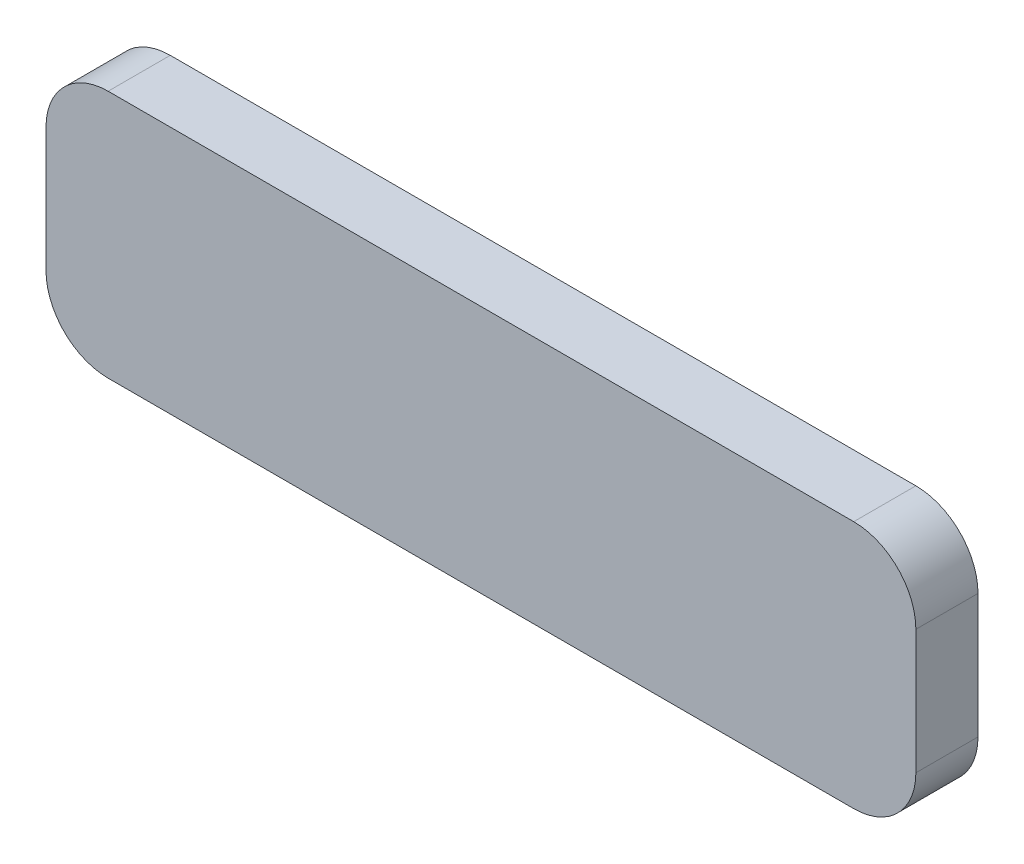
ISO-10303-21;
HEADER;
FILE_DESCRIPTION(('STEP AP214'),'2;1');
FILE_NAME('part.step','',(''),(''),'','','');
FILE_SCHEMA(('AUTOMOTIVE_DESIGN { 1 0 10303 214 1 1 1 1 }'));
ENDSEC;
DATA;
#1=APPLICATION_CONTEXT('core data for automotive mechanical design processes');
#2=APPLICATION_PROTOCOL_DEFINITION('international standard','automotive_design',2000,#1);
#3=PRODUCT_CONTEXT('',#1,'mechanical');
#4=PRODUCT('Part','Part','',(#3));
#5=PRODUCT_RELATED_PRODUCT_CATEGORY('part','',(#4));
#6=PRODUCT_DEFINITION_FORMATION('','',#4);
#7=PRODUCT_DEFINITION_CONTEXT('part definition',#1,'design');
#8=PRODUCT_DEFINITION('design','',#6,#7);
#9=PRODUCT_DEFINITION_SHAPE('','',#8);
#10=(LENGTH_UNIT() NAMED_UNIT(*) SI_UNIT(.MILLI.,.METRE.));
#11=(NAMED_UNIT(*) PLANE_ANGLE_UNIT() SI_UNIT($,.RADIAN.));
#12=(NAMED_UNIT(*) SI_UNIT($,.STERADIAN.) SOLID_ANGLE_UNIT());
#13=UNCERTAINTY_MEASURE_WITH_UNIT(LENGTH_MEASURE(1.E-05),#10,'distance_accuracy_value','');
#14=(GEOMETRIC_REPRESENTATION_CONTEXT(3) GLOBAL_UNCERTAINTY_ASSIGNED_CONTEXT((#13)) GLOBAL_UNIT_ASSIGNED_CONTEXT((#10,
#11,#12)) REPRESENTATION_CONTEXT('',''));
#15=CARTESIAN_POINT('',(0.,0.,0.));
#16=DIRECTION('',(0.,0.,1.));
#17=DIRECTION('',(1.,0.,0.));
#18=AXIS2_PLACEMENT_3D('',#15,#16,#17);
#19=CARTESIAN_POINT('',(1.,1.,1.));
#20=DIRECTION('',(0.,0.,-1.));
#21=DIRECTION('',(-1.,0.,0.));
#22=AXIS2_PLACEMENT_3D('',#19,#20,#21);
#23=CYLINDRICAL_SURFACE('',#22,1.);
#24=CARTESIAN_POINT('',(1.,1.,0.));
#25=DIRECTION('',(0.,0.,1.));
#26=DIRECTION('',(-1.,0.,0.));
#27=AXIS2_PLACEMENT_3D('',#24,#25,#26);
#28=CIRCLE('',#27,1.);
#29=CARTESIAN_POINT('',(0.,1.,0.));
#30=VERTEX_POINT('',#29);
#31=CARTESIAN_POINT('',(1.,0.,0.));
#32=VERTEX_POINT('',#31);
#33=EDGE_CURVE('E133',#30,#32,#28,.T.);
#34=ORIENTED_EDGE('',*,*,#33,.T.);
#35=DIRECTION('',(0.,0.,-1.));
#36=VECTOR('',#35,1.);
#37=CARTESIAN_POINT('',(1.,0.,1.));
#38=LINE('',#37,#36);
#39=CARTESIAN_POINT('',(1.,0.,1.));
#40=VERTEX_POINT('',#39);
#41=EDGE_CURVE('E11',#40,#32,#38,.T.);
#42=ORIENTED_EDGE('',*,*,#41,.F.);
#43=CARTESIAN_POINT('',(1.,1.,1.));
#44=DIRECTION('',(0.,0.,1.));
#45=DIRECTION('',(-1.,0.,0.));
#46=AXIS2_PLACEMENT_3D('',#43,#44,#45);
#47=CIRCLE('',#46,1.);
#48=CARTESIAN_POINT('',(0.,1.,1.));
#49=VERTEX_POINT('',#48);
#50=EDGE_CURVE('E147',#49,#40,#47,.T.);
#51=ORIENTED_EDGE('',*,*,#50,.F.);
#52=DIRECTION('',(0.,0.,-1.));
#53=VECTOR('',#52,1.);
#54=CARTESIAN_POINT('',(0.,1.,1.));
#55=LINE('',#54,#53);
#56=EDGE_CURVE('E129',#49,#30,#55,.T.);
#57=ORIENTED_EDGE('',*,*,#56,.T.);
#58=EDGE_LOOP('',(#34,#42,#51,#57));
#59=FACE_BOUND('',#58,.T.);
#60=ADVANCED_FACE('F37',(#59),#23,.T.);
#61=CARTESIAN_POINT('',(1.,0.,1.));
#62=DIRECTION('',(0.,1.,0.));
#63=DIRECTION('',(0.,0.,1.));
#64=AXIS2_PLACEMENT_3D('',#61,#62,#63);
#65=PLANE('',#64);
#66=DIRECTION('',(1.,0.,0.));
#67=VECTOR('',#66,1.);
#68=CARTESIAN_POINT('',(1.,0.,0.));
#69=LINE('',#68,#67);
#70=CARTESIAN_POINT('',(13.,0.,0.));
#71=VERTEX_POINT('',#70);
#72=EDGE_CURVE('E136',#32,#71,#69,.T.);
#73=ORIENTED_EDGE('',*,*,#72,.T.);
#74=DIRECTION('',(0.,0.,-1.));
#75=VECTOR('',#74,1.);
#76=CARTESIAN_POINT('',(13.,0.,1.));
#77=LINE('',#76,#75);
#78=CARTESIAN_POINT('',(13.,0.,1.));
#79=VERTEX_POINT('',#78);
#80=EDGE_CURVE('E45',#79,#71,#77,.T.);
#81=ORIENTED_EDGE('',*,*,#80,.F.);
#82=DIRECTION('',(1.,0.,0.));
#83=VECTOR('',#82,1.);
#84=CARTESIAN_POINT('',(1.,0.,1.));
#85=LINE('',#84,#83);
#86=EDGE_CURVE('E96',#40,#79,#85,.T.);
#87=ORIENTED_EDGE('',*,*,#86,.F.);
#88=ORIENTED_EDGE('',*,*,#41,.T.);
#89=EDGE_LOOP('',(#73,#81,#87,#88));
#90=FACE_BOUND('',#89,.T.);
#91=ADVANCED_FACE('F182',(#90),#65,.F.);
#92=CARTESIAN_POINT('',(13.,1.,1.));
#93=DIRECTION('',(0.,0.,-1.));
#94=DIRECTION('',(-1.,0.,0.));
#95=AXIS2_PLACEMENT_3D('',#92,#93,#94);
#96=CYLINDRICAL_SURFACE('',#95,1.);
#97=CARTESIAN_POINT('',(13.,1.,0.));
#98=DIRECTION('',(0.,0.,1.));
#99=DIRECTION('',(-1.,0.,0.));
#100=AXIS2_PLACEMENT_3D('',#97,#98,#99);
#101=CIRCLE('',#100,1.);
#102=CARTESIAN_POINT('',(14.,1.,0.));
#103=VERTEX_POINT('',#102);
#104=EDGE_CURVE('E138',#71,#103,#101,.T.);
#105=ORIENTED_EDGE('',*,*,#104,.T.);
#106=DIRECTION('',(0.,0.,-1.));
#107=VECTOR('',#106,1.);
#108=CARTESIAN_POINT('',(14.,1.,1.));
#109=LINE('',#108,#107);
#110=CARTESIAN_POINT('',(14.,1.,1.));
#111=VERTEX_POINT('',#110);
#112=EDGE_CURVE('E154',#111,#103,#109,.T.);
#113=ORIENTED_EDGE('',*,*,#112,.F.);
#114=CARTESIAN_POINT('',(13.,1.,1.));
#115=DIRECTION('',(0.,0.,1.));
#116=DIRECTION('',(-1.,0.,0.));
#117=AXIS2_PLACEMENT_3D('',#114,#115,#116);
#118=CIRCLE('',#117,1.);
#119=EDGE_CURVE('E162',#79,#111,#118,.T.);
#120=ORIENTED_EDGE('',*,*,#119,.F.);
#121=ORIENTED_EDGE('',*,*,#80,.T.);
#122=EDGE_LOOP('',(#105,#113,#120,#121));
#123=FACE_BOUND('',#122,.T.);
#124=ADVANCED_FACE('F160',(#123),#96,.T.);
#125=CARTESIAN_POINT('',(14.,1.,1.));
#126=DIRECTION('',(-1.,0.,0.));
#127=DIRECTION('',(0.,0.,1.));
#128=AXIS2_PLACEMENT_3D('',#125,#126,#127);
#129=PLANE('',#128);
#130=DIRECTION('',(0.,1.,0.));
#131=VECTOR('',#130,1.);
#132=CARTESIAN_POINT('',(14.,1.,0.));
#133=LINE('',#132,#131);
#134=CARTESIAN_POINT('',(14.,3.,0.));
#135=VERTEX_POINT('',#134);
#136=EDGE_CURVE('E140',#103,#135,#133,.T.);
#137=ORIENTED_EDGE('',*,*,#136,.T.);
#138=DIRECTION('',(0.,0.,-1.));
#139=VECTOR('',#138,1.);
#140=CARTESIAN_POINT('',(14.,3.,1.));
#141=LINE('',#140,#139);
#142=CARTESIAN_POINT('',(14.,3.,1.));
#143=VERTEX_POINT('',#142);
#144=EDGE_CURVE('E151',#143,#135,#141,.T.);
#145=ORIENTED_EDGE('',*,*,#144,.F.);
#146=DIRECTION('',(0.,1.,0.));
#147=VECTOR('',#146,1.);
#148=CARTESIAN_POINT('',(14.,1.,1.));
#149=LINE('',#148,#147);
#150=EDGE_CURVE('E174',#111,#143,#149,.T.);
#151=ORIENTED_EDGE('',*,*,#150,.F.);
#152=ORIENTED_EDGE('',*,*,#112,.T.);
#153=EDGE_LOOP('',(#137,#145,#151,#152));
#154=FACE_BOUND('',#153,.T.);
#155=ADVANCED_FACE('F170',(#154),#129,.F.);
#156=CARTESIAN_POINT('',(13.,3.,1.));
#157=DIRECTION('',(0.,0.,-1.));
#158=DIRECTION('',(-1.,0.,0.));
#159=AXIS2_PLACEMENT_3D('',#156,#157,#158);
#160=CYLINDRICAL_SURFACE('',#159,1.);
#161=CARTESIAN_POINT('',(13.,3.,0.));
#162=DIRECTION('',(0.,0.,1.));
#163=DIRECTION('',(-1.,0.,0.));
#164=AXIS2_PLACEMENT_3D('',#161,#162,#163);
#165=CIRCLE('',#164,1.);
#166=CARTESIAN_POINT('',(13.,4.,0.));
#167=VERTEX_POINT('',#166);
#168=EDGE_CURVE('E142',#135,#167,#165,.T.);
#169=ORIENTED_EDGE('',*,*,#168,.T.);
#170=DIRECTION('',(0.,0.,-1.));
#171=VECTOR('',#170,1.);
#172=CARTESIAN_POINT('',(13.,4.,1.));
#173=LINE('',#172,#171);
#174=CARTESIAN_POINT('',(13.,4.,1.));
#175=VERTEX_POINT('',#174);
#176=EDGE_CURVE('E124',#175,#167,#173,.T.);
#177=ORIENTED_EDGE('',*,*,#176,.F.);
#178=CARTESIAN_POINT('',(13.,3.,1.));
#179=DIRECTION('',(0.,0.,1.));
#180=DIRECTION('',(-1.,0.,0.));
#181=AXIS2_PLACEMENT_3D('',#178,#179,#180);
#182=CIRCLE('',#181,1.);
#183=EDGE_CURVE('E115',#143,#175,#182,.T.);
#184=ORIENTED_EDGE('',*,*,#183,.F.);
#185=ORIENTED_EDGE('',*,*,#144,.T.);
#186=EDGE_LOOP('',(#169,#177,#184,#185));
#187=FACE_BOUND('',#186,.T.);
#188=ADVANCED_FACE('F173',(#187),#160,.T.);
#189=CARTESIAN_POINT('',(1.,4.,1.));
#190=DIRECTION('',(0.,-1.,0.));
#191=DIRECTION('',(0.,0.,-1.));
#192=AXIS2_PLACEMENT_3D('',#189,#190,#191);
#193=PLANE('',#192);
#194=DIRECTION('',(-1.,0.,0.));
#195=VECTOR('',#194,1.);
#196=CARTESIAN_POINT('',(1.,4.,0.));
#197=LINE('',#196,#195);
#198=CARTESIAN_POINT('',(1.,4.,0.));
#199=VERTEX_POINT('',#198);
#200=EDGE_CURVE('E123',#167,#199,#197,.T.);
#201=ORIENTED_EDGE('',*,*,#200,.T.);
#202=DIRECTION('',(0.,0.,-1.));
#203=VECTOR('',#202,1.);
#204=CARTESIAN_POINT('',(1.,4.,1.));
#205=LINE('',#204,#203);
#206=CARTESIAN_POINT('',(1.,4.,1.));
#207=VERTEX_POINT('',#206);
#208=EDGE_CURVE('E120',#207,#199,#205,.T.);
#209=ORIENTED_EDGE('',*,*,#208,.F.);
#210=DIRECTION('',(-1.,0.,0.));
#211=VECTOR('',#210,1.);
#212=CARTESIAN_POINT('',(1.,4.,1.));
#213=LINE('',#212,#211);
#214=EDGE_CURVE('E109',#175,#207,#213,.T.);
#215=ORIENTED_EDGE('',*,*,#214,.F.);
#216=ORIENTED_EDGE('',*,*,#176,.T.);
#217=EDGE_LOOP('',(#201,#209,#215,#216));
#218=FACE_BOUND('',#217,.T.);
#219=ADVANCED_FACE('F121',(#218),#193,.F.);
#220=CARTESIAN_POINT('',(1.,3.,1.));
#221=DIRECTION('',(0.,0.,-1.));
#222=DIRECTION('',(-1.,0.,0.));
#223=AXIS2_PLACEMENT_3D('',#220,#221,#222);
#224=CYLINDRICAL_SURFACE('',#223,1.);
#225=CARTESIAN_POINT('',(1.,3.,0.));
#226=DIRECTION('',(0.,0.,1.));
#227=DIRECTION('',(-1.,0.,0.));
#228=AXIS2_PLACEMENT_3D('',#225,#226,#227);
#229=CIRCLE('',#228,1.);
#230=CARTESIAN_POINT('',(0.,3.,0.));
#231=VERTEX_POINT('',#230);
#232=EDGE_CURVE('E82',#199,#231,#229,.T.);
#233=ORIENTED_EDGE('',*,*,#232,.T.);
#234=DIRECTION('',(0.,0.,-1.));
#235=VECTOR('',#234,1.);
#236=CARTESIAN_POINT('',(0.,3.,1.));
#237=LINE('',#236,#235);
#238=CARTESIAN_POINT('',(0.,3.,1.));
#239=VERTEX_POINT('',#238);
#240=EDGE_CURVE('E125',#239,#231,#237,.T.);
#241=ORIENTED_EDGE('',*,*,#240,.F.);
#242=CARTESIAN_POINT('',(1.,3.,1.));
#243=DIRECTION('',(0.,0.,1.));
#244=DIRECTION('',(-1.,0.,0.));
#245=AXIS2_PLACEMENT_3D('',#242,#243,#244);
#246=CIRCLE('',#245,1.);
#247=EDGE_CURVE('E113',#207,#239,#246,.T.);
#248=ORIENTED_EDGE('',*,*,#247,.F.);
#249=ORIENTED_EDGE('',*,*,#208,.T.);
#250=EDGE_LOOP('',(#233,#241,#248,#249));
#251=FACE_BOUND('',#250,.T.);
#252=ADVANCED_FACE('F127',(#251),#224,.T.);
#253=CARTESIAN_POINT('',(0.,1.,1.));
#254=DIRECTION('',(1.,0.,0.));
#255=DIRECTION('',(0.,0.,-1.));
#256=AXIS2_PLACEMENT_3D('',#253,#254,#255);
#257=PLANE('',#256);
#258=DIRECTION('',(0.,-1.,0.));
#259=VECTOR('',#258,1.);
#260=CARTESIAN_POINT('',(0.,1.,0.));
#261=LINE('',#260,#259);
#262=EDGE_CURVE('E88',#231,#30,#261,.T.);
#263=ORIENTED_EDGE('',*,*,#262,.T.);
#264=ORIENTED_EDGE('',*,*,#56,.F.);
#265=DIRECTION('',(0.,-1.,0.));
#266=VECTOR('',#265,1.);
#267=CARTESIAN_POINT('',(0.,1.,1.));
#268=LINE('',#267,#266);
#269=EDGE_CURVE('E53',#239,#49,#268,.T.);
#270=ORIENTED_EDGE('',*,*,#269,.F.);
#271=ORIENTED_EDGE('',*,*,#240,.T.);
#272=EDGE_LOOP('',(#263,#264,#270,#271));
#273=FACE_BOUND('',#272,.T.);
#274=ADVANCED_FACE('F198',(#273),#257,.F.);
#275=CARTESIAN_POINT('',(1.,1.,1.));
#276=DIRECTION('',(0.,0.,-1.));
#277=DIRECTION('',(-1.,0.,0.));
#278=AXIS2_PLACEMENT_3D('',#275,#276,#277);
#279=PLANE('',#278);
#280=ORIENTED_EDGE('',*,*,#50,.T.);
#281=ORIENTED_EDGE('',*,*,#86,.T.);
#282=ORIENTED_EDGE('',*,*,#119,.T.);
#283=ORIENTED_EDGE('',*,*,#150,.T.);
#284=ORIENTED_EDGE('',*,*,#183,.T.);
#285=ORIENTED_EDGE('',*,*,#214,.T.);
#286=ORIENTED_EDGE('',*,*,#247,.T.);
#287=ORIENTED_EDGE('',*,*,#269,.T.);
#288=EDGE_LOOP('',(#280,#281,#282,#283,#284,#285,#286,#287));
#289=FACE_BOUND('',#288,.T.);
#290=ADVANCED_FACE('F111',(#289),#279,.F.);
#291=CARTESIAN_POINT('',(1.,1.,0.));
#292=DIRECTION('',(0.,0.,-1.));
#293=DIRECTION('',(-1.,0.,0.));
#294=AXIS2_PLACEMENT_3D('',#291,#292,#293);
#295=PLANE('',#294);
#296=ORIENTED_EDGE('',*,*,#33,.F.);
#297=ORIENTED_EDGE('',*,*,#262,.F.);
#298=ORIENTED_EDGE('',*,*,#232,.F.);
#299=ORIENTED_EDGE('',*,*,#200,.F.);
#300=ORIENTED_EDGE('',*,*,#168,.F.);
#301=ORIENTED_EDGE('',*,*,#136,.F.);
#302=ORIENTED_EDGE('',*,*,#104,.F.);
#303=ORIENTED_EDGE('',*,*,#72,.F.);
#304=EDGE_LOOP('',(#296,#297,#298,#299,#300,#301,#302,#303));
#305=FACE_BOUND('',#304,.T.);
#306=ADVANCED_FACE('F166',(#305),#295,.T.);
#307=CLOSED_SHELL('',(#60,#91,#124,#155,#188,#219,#252,#274,#290,#306));
#308=MANIFOLD_SOLID_BREP('B2',#307);
#309=ADVANCED_BREP_SHAPE_REPRESENTATION('',(#18,#308),#14);
#310=SHAPE_DEFINITION_REPRESENTATION(#9,#309);
ENDSEC;
END-ISO-10303-21;
